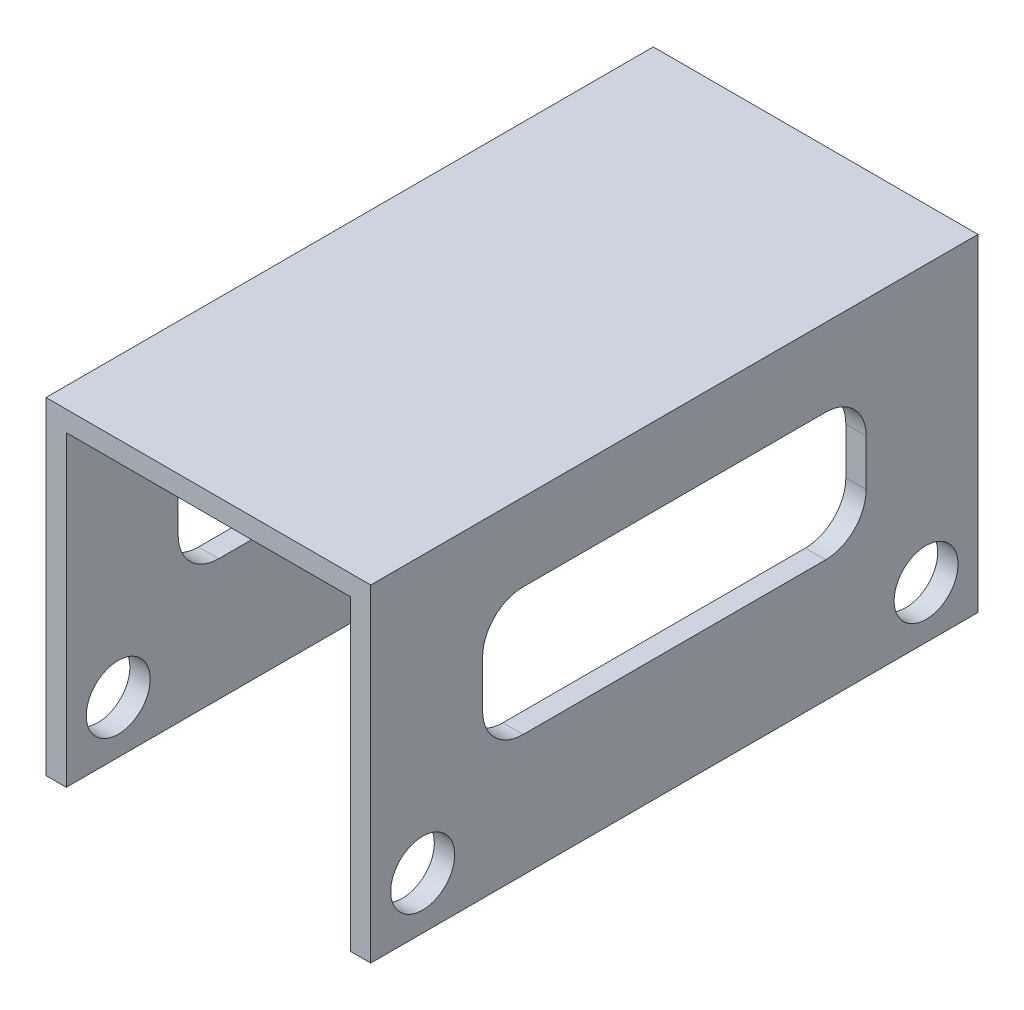
ISO-10303-21;
HEADER;
FILE_DESCRIPTION(('STEP AP214'),'2;1');
FILE_NAME('part.step','',(''),(''),'','','');
FILE_SCHEMA(('AUTOMOTIVE_DESIGN { 1 0 10303 214 1 1 1 1 }'));
ENDSEC;
DATA;
#1=APPLICATION_CONTEXT('core data for automotive mechanical design processes');
#2=APPLICATION_PROTOCOL_DEFINITION('international standard','automotive_design',2000,#1);
#3=PRODUCT_CONTEXT('',#1,'mechanical');
#4=PRODUCT('Part','Part','',(#3));
#5=PRODUCT_RELATED_PRODUCT_CATEGORY('part','',(#4));
#6=PRODUCT_DEFINITION_FORMATION('','',#4);
#7=PRODUCT_DEFINITION_CONTEXT('part definition',#1,'design');
#8=PRODUCT_DEFINITION('design','',#6,#7);
#9=PRODUCT_DEFINITION_SHAPE('','',#8);
#10=(LENGTH_UNIT() NAMED_UNIT(*) SI_UNIT(.MILLI.,.METRE.));
#11=(NAMED_UNIT(*) PLANE_ANGLE_UNIT() SI_UNIT($,.RADIAN.));
#12=(NAMED_UNIT(*) SI_UNIT($,.STERADIAN.) SOLID_ANGLE_UNIT());
#13=UNCERTAINTY_MEASURE_WITH_UNIT(LENGTH_MEASURE(1.E-05),#10,'distance_accuracy_value','');
#14=(GEOMETRIC_REPRESENTATION_CONTEXT(3) GLOBAL_UNCERTAINTY_ASSIGNED_CONTEXT((#13)) GLOBAL_UNIT_ASSIGNED_CONTEXT((#10,
#11,#12)) REPRESENTATION_CONTEXT('',''));
#15=CARTESIAN_POINT('',(0.,0.,0.));
#16=DIRECTION('',(0.,0.,1.));
#17=DIRECTION('',(1.,0.,0.));
#18=AXIS2_PLACEMENT_3D('',#15,#16,#17);
#19=CARTESIAN_POINT('',(0.,0.,95.));
#20=DIRECTION('',(0.,0.,-1.));
#21=DIRECTION('',(-1.,0.,0.));
#22=AXIS2_PLACEMENT_3D('',#19,#20,#21);
#23=PLANE('',#22);
#24=DIRECTION('',(1.,0.,0.));
#25=VECTOR('',#24,1.);
#26=CARTESIAN_POINT('',(-25.4,-13.125,95.));
#27=LINE('',#26,#25);
#28=CARTESIAN_POINT('',(22.225,-13.125,95.));
#29=VERTEX_POINT('',#28);
#30=CARTESIAN_POINT('',(25.4,-13.125,95.));
#31=VERTEX_POINT('',#30);
#32=EDGE_CURVE('E210',#29,#31,#27,.T.);
#33=ORIENTED_EDGE('',*,*,#32,.T.);
#34=DIRECTION('',(0.,1.,0.));
#35=VECTOR('',#34,1.);
#36=CARTESIAN_POINT('',(25.4,-38.1,95.));
#37=LINE('',#36,#35);
#38=CARTESIAN_POINT('',(25.4,38.1,95.));
#39=VERTEX_POINT('',#38);
#40=EDGE_CURVE('E231',#31,#39,#37,.T.);
#41=ORIENTED_EDGE('',*,*,#40,.T.);
#42=DIRECTION('',(-1.,0.,0.));
#43=VECTOR('',#42,1.);
#44=CARTESIAN_POINT('',(-25.4,38.1,95.));
#45=LINE('',#44,#43);
#46=CARTESIAN_POINT('',(-25.4,38.1,95.));
#47=VERTEX_POINT('',#46);
#48=EDGE_CURVE('E225',#39,#47,#45,.T.);
#49=ORIENTED_EDGE('',*,*,#48,.T.);
#50=DIRECTION('',(0.,-1.,0.));
#51=VECTOR('',#50,1.);
#52=CARTESIAN_POINT('',(-25.4,-38.1,95.));
#53=LINE('',#52,#51);
#54=CARTESIAN_POINT('',(-25.4,-13.125,95.));
#55=VERTEX_POINT('',#54);
#56=EDGE_CURVE('E218',#47,#55,#53,.T.);
#57=ORIENTED_EDGE('',*,*,#56,.T.);
#58=CARTESIAN_POINT('',(-22.225,-13.125,95.));
#59=VERTEX_POINT('',#58);
#60=EDGE_CURVE('E199',#55,#59,#27,.T.);
#61=ORIENTED_EDGE('',*,*,#60,.T.);
#62=DIRECTION('',(0.,-1.,0.));
#63=VECTOR('',#62,1.);
#64=CARTESIAN_POINT('',(-22.225,-34.925,95.));
#65=LINE('',#64,#63);
#66=CARTESIAN_POINT('',(-22.225,34.925,95.));
#67=VERTEX_POINT('',#66);
#68=EDGE_CURVE('E413',#67,#59,#65,.T.);
#69=ORIENTED_EDGE('',*,*,#68,.F.);
#70=DIRECTION('',(-1.,0.,0.));
#71=VECTOR('',#70,1.);
#72=CARTESIAN_POINT('',(-22.225,34.925,95.));
#73=LINE('',#72,#71);
#74=CARTESIAN_POINT('',(22.225,34.925,95.));
#75=VERTEX_POINT('',#74);
#76=EDGE_CURVE('E418',#75,#67,#73,.T.);
#77=ORIENTED_EDGE('',*,*,#76,.F.);
#78=DIRECTION('',(0.,1.,0.));
#79=VECTOR('',#78,1.);
#80=CARTESIAN_POINT('',(22.225,-34.925,95.));
#81=LINE('',#80,#79);
#82=EDGE_CURVE('E415',#29,#75,#81,.T.);
#83=ORIENTED_EDGE('',*,*,#82,.F.);
#84=EDGE_LOOP('',(#33,#41,#49,#57,#61,#69,#77,#83));
#85=FACE_BOUND('',#84,.T.);
#86=ADVANCED_FACE('F39',(#85),#23,.F.);
#87=CARTESIAN_POINT('',(0.,0.,0.));
#88=DIRECTION('',(0.,0.,-1.));
#89=DIRECTION('',(-1.,0.,0.));
#90=AXIS2_PLACEMENT_3D('',#87,#88,#89);
#91=PLANE('',#90);
#92=DIRECTION('',(0.,1.,0.));
#93=VECTOR('',#92,1.);
#94=CARTESIAN_POINT('',(25.4,-38.1,0.));
#95=LINE('',#94,#93);
#96=CARTESIAN_POINT('',(25.4,-13.125,0.));
#97=VERTEX_POINT('',#96);
#98=CARTESIAN_POINT('',(25.4,38.1,0.));
#99=VERTEX_POINT('',#98);
#100=EDGE_CURVE('E235',#97,#99,#95,.T.);
#101=ORIENTED_EDGE('',*,*,#100,.F.);
#102=DIRECTION('',(1.,0.,0.));
#103=VECTOR('',#102,1.);
#104=CARTESIAN_POINT('',(-25.4,-13.125,0.));
#105=LINE('',#104,#103);
#106=CARTESIAN_POINT('',(22.225,-13.125,0.));
#107=VERTEX_POINT('',#106);
#108=EDGE_CURVE('E391',#107,#97,#105,.T.);
#109=ORIENTED_EDGE('',*,*,#108,.F.);
#110=DIRECTION('',(0.,1.,0.));
#111=VECTOR('',#110,1.);
#112=CARTESIAN_POINT('',(22.225,-34.925,0.));
#113=LINE('',#112,#111);
#114=CARTESIAN_POINT('',(22.225,34.925,0.));
#115=VERTEX_POINT('',#114);
#116=EDGE_CURVE('E423',#107,#115,#113,.T.);
#117=ORIENTED_EDGE('',*,*,#116,.T.);
#118=DIRECTION('',(-1.,0.,0.));
#119=VECTOR('',#118,1.);
#120=CARTESIAN_POINT('',(-22.225,34.925,0.));
#121=LINE('',#120,#119);
#122=CARTESIAN_POINT('',(-22.225,34.925,0.));
#123=VERTEX_POINT('',#122);
#124=EDGE_CURVE('E416',#115,#123,#121,.T.);
#125=ORIENTED_EDGE('',*,*,#124,.T.);
#126=DIRECTION('',(0.,-1.,0.));
#127=VECTOR('',#126,1.);
#128=CARTESIAN_POINT('',(-22.225,-34.925,0.));
#129=LINE('',#128,#127);
#130=CARTESIAN_POINT('',(-22.225,-13.125,0.));
#131=VERTEX_POINT('',#130);
#132=EDGE_CURVE('E412',#123,#131,#129,.T.);
#133=ORIENTED_EDGE('',*,*,#132,.T.);
#134=CARTESIAN_POINT('',(-25.4,-13.125,0.));
#135=VERTEX_POINT('',#134);
#136=EDGE_CURVE('E390',#135,#131,#105,.T.);
#137=ORIENTED_EDGE('',*,*,#136,.F.);
#138=DIRECTION('',(0.,-1.,0.));
#139=VECTOR('',#138,1.);
#140=CARTESIAN_POINT('',(-25.4,-38.1,0.));
#141=LINE('',#140,#139);
#142=CARTESIAN_POINT('',(-25.4,38.1,0.));
#143=VERTEX_POINT('',#142);
#144=EDGE_CURVE('E220',#143,#135,#141,.T.);
#145=ORIENTED_EDGE('',*,*,#144,.F.);
#146=DIRECTION('',(-1.,0.,0.));
#147=VECTOR('',#146,1.);
#148=CARTESIAN_POINT('',(-25.4,38.1,0.));
#149=LINE('',#148,#147);
#150=EDGE_CURVE('E237',#99,#143,#149,.T.);
#151=ORIENTED_EDGE('',*,*,#150,.F.);
#152=EDGE_LOOP('',(#101,#109,#117,#125,#133,#137,#145,#151));
#153=FACE_BOUND('',#152,.T.);
#154=ADVANCED_FACE('F441',(#153),#91,.T.);
#155=CARTESIAN_POINT('',(25.4,-38.1,95.));
#156=DIRECTION('',(-1.,0.,0.));
#157=DIRECTION('',(0.,0.,1.));
#158=AXIS2_PLACEMENT_3D('',#155,#156,#157);
#159=PLANE('',#158);
#160=DIRECTION('',(0.,0.,1.));
#161=VECTOR('',#160,1.);
#162=CARTESIAN_POINT('',(25.4,25.925,17.5));
#163=LINE('',#162,#161);
#164=CARTESIAN_POINT('',(25.4,25.925,23.85));
#165=VERTEX_POINT('',#164);
#166=CARTESIAN_POINT('',(25.4,25.925,71.15));
#167=VERTEX_POINT('',#166);
#168=EDGE_CURVE('E337',#165,#167,#163,.T.);
#169=ORIENTED_EDGE('',*,*,#168,.F.);
#170=CARTESIAN_POINT('',(25.4,19.575,23.85));
#171=DIRECTION('',(-1.,0.,0.));
#172=DIRECTION('',(0.,0.,1.));
#173=AXIS2_PLACEMENT_3D('',#170,#171,#172);
#174=CIRCLE('',#173,6.35);
#175=CARTESIAN_POINT('',(25.4,19.575,17.5));
#176=VERTEX_POINT('',#175);
#177=EDGE_CURVE('E320',#165,#176,#174,.T.);
#178=ORIENTED_EDGE('',*,*,#177,.T.);
#179=DIRECTION('',(0.,1.,0.));
#180=VECTOR('',#179,1.);
#181=CARTESIAN_POINT('',(25.4,5.92499999999999,17.5));
#182=LINE('',#181,#180);
#183=CARTESIAN_POINT('',(25.4,12.275,17.5));
#184=VERTEX_POINT('',#183);
#185=EDGE_CURVE('E345',#184,#176,#182,.T.);
#186=ORIENTED_EDGE('',*,*,#185,.F.);
#187=CARTESIAN_POINT('',(25.4,12.275,23.85));
#188=DIRECTION('',(-1.,0.,0.));
#189=DIRECTION('',(0.,0.,1.));
#190=AXIS2_PLACEMENT_3D('',#187,#188,#189);
#191=CIRCLE('',#190,6.35);
#192=CARTESIAN_POINT('',(25.4,5.92499999999999,23.85));
#193=VERTEX_POINT('',#192);
#194=EDGE_CURVE('E324',#184,#193,#191,.T.);
#195=ORIENTED_EDGE('',*,*,#194,.T.);
#196=DIRECTION('',(0.,0.,1.));
#197=VECTOR('',#196,1.);
#198=CARTESIAN_POINT('',(25.4,5.92499999999999,17.5));
#199=LINE('',#198,#197);
#200=CARTESIAN_POINT('',(25.4,5.92499999999999,71.15));
#201=VERTEX_POINT('',#200);
#202=EDGE_CURVE('E360',#193,#201,#199,.T.);
#203=ORIENTED_EDGE('',*,*,#202,.T.);
#204=CARTESIAN_POINT('',(25.4,12.275,71.15));
#205=DIRECTION('',(-1.,0.,0.));
#206=DIRECTION('',(0.,0.,1.));
#207=AXIS2_PLACEMENT_3D('',#204,#205,#206);
#208=CIRCLE('',#207,6.35);
#209=CARTESIAN_POINT('',(25.4,12.275,77.5));
#210=VERTEX_POINT('',#209);
#211=EDGE_CURVE('E328',#201,#210,#208,.T.);
#212=ORIENTED_EDGE('',*,*,#211,.T.);
#213=DIRECTION('',(0.,1.,0.));
#214=VECTOR('',#213,1.);
#215=CARTESIAN_POINT('',(25.4,5.92499999999999,77.5));
#216=LINE('',#215,#214);
#217=CARTESIAN_POINT('',(25.4,19.575,77.5));
#218=VERTEX_POINT('',#217);
#219=EDGE_CURVE('E338',#210,#218,#216,.T.);
#220=ORIENTED_EDGE('',*,*,#219,.T.);
#221=CARTESIAN_POINT('',(25.4,19.575,71.15));
#222=DIRECTION('',(-1.,0.,0.));
#223=DIRECTION('',(0.,0.,1.));
#224=AXIS2_PLACEMENT_3D('',#221,#222,#223);
#225=CIRCLE('',#224,6.35);
#226=EDGE_CURVE('E47',#218,#167,#225,.T.);
#227=ORIENTED_EDGE('',*,*,#226,.T.);
#228=EDGE_LOOP('',(#169,#178,#186,#195,#203,#212,#220,#227));
#229=FACE_BOUND('',#228,.T.);
#230=CARTESIAN_POINT('',(25.4,-5.,86.875));
#231=DIRECTION('',(1.,0.,0.));
#232=DIRECTION('',(0.,0.,-1.));
#233=AXIS2_PLACEMENT_3D('',#230,#231,#232);
#234=CIRCLE('',#233,5.);
#235=CARTESIAN_POINT('',(25.4,-5.,81.875));
#236=VERTEX_POINT('',#235);
#237=EDGE_CURVE('E381',#236,#236,#234,.T.);
#238=ORIENTED_EDGE('',*,*,#237,.F.);
#239=EDGE_LOOP('',(#238));
#240=FACE_BOUND('',#239,.T.);
#241=DIRECTION('',(0.,0.,-1.));
#242=VECTOR('',#241,1.);
#243=CARTESIAN_POINT('',(25.4,-13.125,95.));
#244=LINE('',#243,#242);
#245=EDGE_CURVE('E221',#31,#97,#244,.T.);
#246=ORIENTED_EDGE('',*,*,#245,.T.);
#247=ORIENTED_EDGE('',*,*,#100,.T.);
#248=DIRECTION('',(0.,0.,-1.));
#249=VECTOR('',#248,1.);
#250=CARTESIAN_POINT('',(25.4,38.1,95.));
#251=LINE('',#250,#249);
#252=EDGE_CURVE('E229',#39,#99,#251,.T.);
#253=ORIENTED_EDGE('',*,*,#252,.F.);
#254=ORIENTED_EDGE('',*,*,#40,.F.);
#255=EDGE_LOOP('',(#246,#247,#253,#254));
#256=FACE_BOUND('',#255,.T.);
#257=CARTESIAN_POINT('',(25.4,-5.,8.12499999999999));
#258=DIRECTION('',(-1.,0.,0.));
#259=DIRECTION('',(0.,0.,1.));
#260=AXIS2_PLACEMENT_3D('',#257,#258,#259);
#261=CIRCLE('',#260,5.);
#262=CARTESIAN_POINT('',(25.4,-5.,13.125));
#263=VERTEX_POINT('',#262);
#264=EDGE_CURVE('E382',#263,#263,#261,.T.);
#265=ORIENTED_EDGE('',*,*,#264,.T.);
#266=EDGE_LOOP('',(#265));
#267=FACE_BOUND('',#266,.T.);
#268=ADVANCED_FACE('F335',(#229,#240,#256,#267),#159,.F.);
#269=CARTESIAN_POINT('',(-25.4,-38.1,95.));
#270=DIRECTION('',(1.,0.,0.));
#271=DIRECTION('',(0.,0.,-1.));
#272=AXIS2_PLACEMENT_3D('',#269,#270,#271);
#273=PLANE('',#272);
#274=DIRECTION('',(0.,0.,1.));
#275=VECTOR('',#274,1.);
#276=CARTESIAN_POINT('',(-25.4,5.92499999999999,17.5));
#277=LINE('',#276,#275);
#278=CARTESIAN_POINT('',(-25.4,5.92499999999999,23.85));
#279=VERTEX_POINT('',#278);
#280=CARTESIAN_POINT('',(-25.4,5.92499999999999,71.15));
#281=VERTEX_POINT('',#280);
#282=EDGE_CURVE('E375',#279,#281,#277,.T.);
#283=ORIENTED_EDGE('',*,*,#282,.F.);
#284=CARTESIAN_POINT('',(-25.4,12.275,23.85));
#285=DIRECTION('',(1.,0.,0.));
#286=DIRECTION('',(0.,0.,-1.));
#287=AXIS2_PLACEMENT_3D('',#284,#285,#286);
#288=CIRCLE('',#287,6.35);
#289=CARTESIAN_POINT('',(-25.4,12.275,17.5));
#290=VERTEX_POINT('',#289);
#291=EDGE_CURVE('E314',#279,#290,#288,.T.);
#292=ORIENTED_EDGE('',*,*,#291,.T.);
#293=DIRECTION('',(0.,1.,0.));
#294=VECTOR('',#293,1.);
#295=CARTESIAN_POINT('',(-25.4,5.92499999999999,17.5));
#296=LINE('',#295,#294);
#297=CARTESIAN_POINT('',(-25.4,19.575,17.5));
#298=VERTEX_POINT('',#297);
#299=EDGE_CURVE('E363',#290,#298,#296,.T.);
#300=ORIENTED_EDGE('',*,*,#299,.T.);
#301=CARTESIAN_POINT('',(-25.4,19.575,23.85));
#302=DIRECTION('',(1.,0.,0.));
#303=DIRECTION('',(0.,0.,-1.));
#304=AXIS2_PLACEMENT_3D('',#301,#302,#303);
#305=CIRCLE('',#304,6.35);
#306=CARTESIAN_POINT('',(-25.4,25.925,23.85));
#307=VERTEX_POINT('',#306);
#308=EDGE_CURVE('E318',#298,#307,#305,.T.);
#309=ORIENTED_EDGE('',*,*,#308,.T.);
#310=DIRECTION('',(0.,0.,1.));
#311=VECTOR('',#310,1.);
#312=CARTESIAN_POINT('',(-25.4,25.925,17.5));
#313=LINE('',#312,#311);
#314=CARTESIAN_POINT('',(-25.4,25.925,71.15));
#315=VERTEX_POINT('',#314);
#316=EDGE_CURVE('E366',#307,#315,#313,.T.);
#317=ORIENTED_EDGE('',*,*,#316,.T.);
#318=CARTESIAN_POINT('',(-25.4,19.575,71.15));
#319=DIRECTION('',(1.,0.,0.));
#320=DIRECTION('',(0.,0.,-1.));
#321=AXIS2_PLACEMENT_3D('',#318,#319,#320);
#322=CIRCLE('',#321,6.35);
#323=CARTESIAN_POINT('',(-25.4,19.575,77.5));
#324=VERTEX_POINT('',#323);
#325=EDGE_CURVE('E310',#315,#324,#322,.T.);
#326=ORIENTED_EDGE('',*,*,#325,.T.);
#327=DIRECTION('',(0.,1.,0.));
#328=VECTOR('',#327,1.);
#329=CARTESIAN_POINT('',(-25.4,5.92499999999999,77.5));
#330=LINE('',#329,#328);
#331=CARTESIAN_POINT('',(-25.4,12.275,77.5));
#332=VERTEX_POINT('',#331);
#333=EDGE_CURVE('E372',#332,#324,#330,.T.);
#334=ORIENTED_EDGE('',*,*,#333,.F.);
#335=CARTESIAN_POINT('',(-25.4,12.275,71.15));
#336=DIRECTION('',(1.,0.,0.));
#337=DIRECTION('',(0.,0.,-1.));
#338=AXIS2_PLACEMENT_3D('',#335,#336,#337);
#339=CIRCLE('',#338,6.35);
#340=EDGE_CURVE('E306',#332,#281,#339,.T.);
#341=ORIENTED_EDGE('',*,*,#340,.T.);
#342=EDGE_LOOP('',(#283,#292,#300,#309,#317,#326,#334,#341));
#343=FACE_BOUND('',#342,.T.);
#344=CARTESIAN_POINT('',(-25.4,-5.,86.875));
#345=DIRECTION('',(1.,0.,0.));
#346=DIRECTION('',(0.,0.,-1.));
#347=AXIS2_PLACEMENT_3D('',#344,#345,#346);
#348=CIRCLE('',#347,5.);
#349=CARTESIAN_POINT('',(-25.4,-5.,81.875));
#350=VERTEX_POINT('',#349);
#351=EDGE_CURVE('E378',#350,#350,#348,.T.);
#352=ORIENTED_EDGE('',*,*,#351,.T.);
#353=EDGE_LOOP('',(#352));
#354=FACE_BOUND('',#353,.T.);
#355=DIRECTION('',(0.,0.,-1.));
#356=VECTOR('',#355,1.);
#357=CARTESIAN_POINT('',(-25.4,-13.125,95.));
#358=LINE('',#357,#356);
#359=EDGE_CURVE('E202',#55,#135,#358,.T.);
#360=ORIENTED_EDGE('',*,*,#359,.F.);
#361=ORIENTED_EDGE('',*,*,#56,.F.);
#362=DIRECTION('',(0.,0.,-1.));
#363=VECTOR('',#362,1.);
#364=CARTESIAN_POINT('',(-25.4,38.1,95.));
#365=LINE('',#364,#363);
#366=EDGE_CURVE('E227',#47,#143,#365,.T.);
#367=ORIENTED_EDGE('',*,*,#366,.T.);
#368=ORIENTED_EDGE('',*,*,#144,.T.);
#369=EDGE_LOOP('',(#360,#361,#367,#368));
#370=FACE_BOUND('',#369,.T.);
#371=CARTESIAN_POINT('',(-25.4,-5.,8.12499999999999));
#372=DIRECTION('',(-1.,0.,0.));
#373=DIRECTION('',(0.,0.,1.));
#374=AXIS2_PLACEMENT_3D('',#371,#372,#373);
#375=CIRCLE('',#374,5.);
#376=CARTESIAN_POINT('',(-25.4,-5.,13.125));
#377=VERTEX_POINT('',#376);
#378=EDGE_CURVE('E385',#377,#377,#375,.T.);
#379=ORIENTED_EDGE('',*,*,#378,.F.);
#380=EDGE_LOOP('',(#379));
#381=FACE_BOUND('',#380,.T.);
#382=ADVANCED_FACE('F215',(#343,#354,#370,#381),#273,.F.);
#383=CARTESIAN_POINT('',(-22.225,-34.925,95.));
#384=DIRECTION('',(1.,0.,0.));
#385=DIRECTION('',(0.,0.,-1.));
#386=AXIS2_PLACEMENT_3D('',#383,#384,#385);
#387=PLANE('',#386);
#388=DIRECTION('',(0.,1.,0.));
#389=VECTOR('',#388,1.);
#390=CARTESIAN_POINT('',(-22.225,-34.925,17.5));
#391=LINE('',#390,#389);
#392=CARTESIAN_POINT('',(-22.225,12.275,17.5));
#393=VERTEX_POINT('',#392);
#394=CARTESIAN_POINT('',(-22.225,19.575,17.5));
#395=VERTEX_POINT('',#394);
#396=EDGE_CURVE('E409',#393,#395,#391,.T.);
#397=ORIENTED_EDGE('',*,*,#396,.F.);
#398=CARTESIAN_POINT('',(-22.225,12.275,23.85));
#399=DIRECTION('',(1.,0.,0.));
#400=DIRECTION('',(0.,0.,-1.));
#401=AXIS2_PLACEMENT_3D('',#398,#399,#400);
#402=CIRCLE('',#401,6.35);
#403=CARTESIAN_POINT('',(-22.225,5.92499999999999,23.85));
#404=VERTEX_POINT('',#403);
#405=EDGE_CURVE('E312',#393,#404,#402,.F.);
#406=ORIENTED_EDGE('',*,*,#405,.T.);
#407=DIRECTION('',(0.,0.,1.));
#408=VECTOR('',#407,1.);
#409=CARTESIAN_POINT('',(-22.225,5.92499999999999,95.));
#410=LINE('',#409,#408);
#411=CARTESIAN_POINT('',(-22.225,5.92499999999999,71.15));
#412=VERTEX_POINT('',#411);
#413=EDGE_CURVE('E406',#404,#412,#410,.T.);
#414=ORIENTED_EDGE('',*,*,#413,.T.);
#415=CARTESIAN_POINT('',(-22.225,12.275,71.15));
#416=DIRECTION('',(1.,0.,0.));
#417=DIRECTION('',(0.,0.,-1.));
#418=AXIS2_PLACEMENT_3D('',#415,#416,#417);
#419=CIRCLE('',#418,6.35);
#420=CARTESIAN_POINT('',(-22.225,12.275,77.5));
#421=VERTEX_POINT('',#420);
#422=EDGE_CURVE('E304',#412,#421,#419,.F.);
#423=ORIENTED_EDGE('',*,*,#422,.T.);
#424=DIRECTION('',(0.,1.,0.));
#425=VECTOR('',#424,1.);
#426=CARTESIAN_POINT('',(-22.225,-34.925,77.5));
#427=LINE('',#426,#425);
#428=CARTESIAN_POINT('',(-22.225,19.575,77.5));
#429=VERTEX_POINT('',#428);
#430=EDGE_CURVE('E403',#421,#429,#427,.T.);
#431=ORIENTED_EDGE('',*,*,#430,.T.);
#432=CARTESIAN_POINT('',(-22.225,19.575,71.15));
#433=DIRECTION('',(1.,0.,0.));
#434=DIRECTION('',(0.,0.,-1.));
#435=AXIS2_PLACEMENT_3D('',#432,#433,#434);
#436=CIRCLE('',#435,6.35);
#437=CARTESIAN_POINT('',(-22.225,25.925,71.15));
#438=VERTEX_POINT('',#437);
#439=EDGE_CURVE('E308',#429,#438,#436,.F.);
#440=ORIENTED_EDGE('',*,*,#439,.T.);
#441=DIRECTION('',(0.,0.,1.));
#442=VECTOR('',#441,1.);
#443=CARTESIAN_POINT('',(-22.225,25.925,95.));
#444=LINE('',#443,#442);
#445=CARTESIAN_POINT('',(-22.225,25.925,23.85));
#446=VERTEX_POINT('',#445);
#447=EDGE_CURVE('E400',#446,#438,#444,.T.);
#448=ORIENTED_EDGE('',*,*,#447,.F.);
#449=CARTESIAN_POINT('',(-22.225,19.575,23.85));
#450=DIRECTION('',(1.,0.,0.));
#451=DIRECTION('',(0.,0.,-1.));
#452=AXIS2_PLACEMENT_3D('',#449,#450,#451);
#453=CIRCLE('',#452,6.35);
#454=EDGE_CURVE('E316',#446,#395,#453,.F.);
#455=ORIENTED_EDGE('',*,*,#454,.T.);
#456=EDGE_LOOP('',(#397,#406,#414,#423,#431,#440,#448,#455));
#457=FACE_BOUND('',#456,.T.);
#458=CARTESIAN_POINT('',(-22.225,-5.,86.875));
#459=DIRECTION('',(1.,0.,0.));
#460=DIRECTION('',(0.,0.,-1.));
#461=AXIS2_PLACEMENT_3D('',#458,#459,#460);
#462=CIRCLE('',#461,5.);
#463=CARTESIAN_POINT('',(-22.225,-5.,81.875));
#464=VERTEX_POINT('',#463);
#465=EDGE_CURVE('E254',#464,#464,#462,.T.);
#466=ORIENTED_EDGE('',*,*,#465,.F.);
#467=EDGE_LOOP('',(#466));
#468=FACE_BOUND('',#467,.T.);
#469=ORIENTED_EDGE('',*,*,#68,.T.);
#470=DIRECTION('',(0.,0.,-1.));
#471=VECTOR('',#470,1.);
#472=CARTESIAN_POINT('',(-22.225,-13.125,95.));
#473=LINE('',#472,#471);
#474=EDGE_CURVE('E205',#59,#131,#473,.T.);
#475=ORIENTED_EDGE('',*,*,#474,.T.);
#476=ORIENTED_EDGE('',*,*,#132,.F.);
#477=DIRECTION('',(0.,0.,-1.));
#478=VECTOR('',#477,1.);
#479=CARTESIAN_POINT('',(-22.225,34.925,95.));
#480=LINE('',#479,#478);
#481=EDGE_CURVE('E420',#67,#123,#480,.T.);
#482=ORIENTED_EDGE('',*,*,#481,.F.);
#483=EDGE_LOOP('',(#469,#475,#476,#482));
#484=FACE_BOUND('',#483,.T.);
#485=CARTESIAN_POINT('',(-22.225,-5.,8.12499999999999));
#486=DIRECTION('',(1.,0.,0.));
#487=DIRECTION('',(0.,0.,-1.));
#488=AXIS2_PLACEMENT_3D('',#485,#486,#487);
#489=CIRCLE('',#488,5.);
#490=CARTESIAN_POINT('',(-22.225,-5.,3.12499999999999));
#491=VERTEX_POINT('',#490);
#492=EDGE_CURVE('E250',#491,#491,#489,.F.);
#493=ORIENTED_EDGE('',*,*,#492,.T.);
#494=EDGE_LOOP('',(#493));
#495=FACE_BOUND('',#494,.T.);
#496=ADVANCED_FACE('F443',(#457,#468,#484,#495),#387,.T.);
#497=CARTESIAN_POINT('',(22.225,-34.925,95.));
#498=DIRECTION('',(-1.,0.,0.));
#499=DIRECTION('',(0.,-1.,0.));
#500=AXIS2_PLACEMENT_3D('',#497,#498,#499);
#501=PLANE('',#500);
#502=DIRECTION('',(0.,-1.,0.));
#503=VECTOR('',#502,1.);
#504=CARTESIAN_POINT('',(22.225,-34.925,17.5));
#505=LINE('',#504,#503);
#506=CARTESIAN_POINT('',(22.225,19.575,17.5));
#507=VERTEX_POINT('',#506);
#508=CARTESIAN_POINT('',(22.225,12.275,17.5));
#509=VERTEX_POINT('',#508);
#510=EDGE_CURVE('E262',#507,#509,#505,.T.);
#511=ORIENTED_EDGE('',*,*,#510,.F.);
#512=CARTESIAN_POINT('',(22.225,19.575,23.85));
#513=DIRECTION('',(-1.,0.,0.));
#514=DIRECTION('',(0.,-1.,0.));
#515=AXIS2_PLACEMENT_3D('',#512,#513,#514);
#516=CIRCLE('',#515,6.35);
#517=CARTESIAN_POINT('',(22.225,25.925,23.85));
#518=VERTEX_POINT('',#517);
#519=EDGE_CURVE('E322',#507,#518,#516,.F.);
#520=ORIENTED_EDGE('',*,*,#519,.T.);
#521=DIRECTION('',(0.,0.,-1.));
#522=VECTOR('',#521,1.);
#523=CARTESIAN_POINT('',(22.225,25.925,95.));
#524=LINE('',#523,#522);
#525=CARTESIAN_POINT('',(22.225,25.925,71.15));
#526=VERTEX_POINT('',#525);
#527=EDGE_CURVE('E246',#526,#518,#524,.T.);
#528=ORIENTED_EDGE('',*,*,#527,.F.);
#529=CARTESIAN_POINT('',(22.225,19.575,71.15));
#530=DIRECTION('',(-1.,0.,0.));
#531=DIRECTION('',(0.,-1.,0.));
#532=AXIS2_PLACEMENT_3D('',#529,#530,#531);
#533=CIRCLE('',#532,6.35);
#534=CARTESIAN_POINT('',(22.225,19.575,77.5));
#535=VERTEX_POINT('',#534);
#536=EDGE_CURVE('E11',#526,#535,#533,.F.);
#537=ORIENTED_EDGE('',*,*,#536,.T.);
#538=DIRECTION('',(0.,-1.,0.));
#539=VECTOR('',#538,1.);
#540=CARTESIAN_POINT('',(22.225,-34.925,77.5));
#541=LINE('',#540,#539);
#542=CARTESIAN_POINT('',(22.225,12.275,77.5));
#543=VERTEX_POINT('',#542);
#544=EDGE_CURVE('E257',#535,#543,#541,.T.);
#545=ORIENTED_EDGE('',*,*,#544,.T.);
#546=CARTESIAN_POINT('',(22.225,12.275,71.15));
#547=DIRECTION('',(-1.,0.,0.));
#548=DIRECTION('',(0.,-1.,0.));
#549=AXIS2_PLACEMENT_3D('',#546,#547,#548);
#550=CIRCLE('',#549,6.35);
#551=CARTESIAN_POINT('',(22.225,5.92499999999999,71.15));
#552=VERTEX_POINT('',#551);
#553=EDGE_CURVE('E330',#543,#552,#550,.F.);
#554=ORIENTED_EDGE('',*,*,#553,.T.);
#555=DIRECTION('',(0.,0.,-1.));
#556=VECTOR('',#555,1.);
#557=CARTESIAN_POINT('',(22.225,5.92499999999999,95.));
#558=LINE('',#557,#556);
#559=CARTESIAN_POINT('',(22.225,5.92499999999999,23.85));
#560=VERTEX_POINT('',#559);
#561=EDGE_CURVE('E259',#552,#560,#558,.T.);
#562=ORIENTED_EDGE('',*,*,#561,.T.);
#563=CARTESIAN_POINT('',(22.225,12.275,23.85));
#564=DIRECTION('',(-1.,0.,0.));
#565=DIRECTION('',(0.,-1.,0.));
#566=AXIS2_PLACEMENT_3D('',#563,#564,#565);
#567=CIRCLE('',#566,6.35);
#568=EDGE_CURVE('E326',#560,#509,#567,.F.);
#569=ORIENTED_EDGE('',*,*,#568,.T.);
#570=EDGE_LOOP('',(#511,#520,#528,#537,#545,#554,#562,#569));
#571=FACE_BOUND('',#570,.T.);
#572=CARTESIAN_POINT('',(22.225,-5.,86.875));
#573=DIRECTION('',(-1.,0.,0.));
#574=DIRECTION('',(0.,-1.,0.));
#575=AXIS2_PLACEMENT_3D('',#572,#573,#574);
#576=CIRCLE('',#575,5.);
#577=CARTESIAN_POINT('',(22.225,-10.,86.875));
#578=VERTEX_POINT('',#577);
#579=EDGE_CURVE('E251',#578,#578,#576,.T.);
#580=ORIENTED_EDGE('',*,*,#579,.F.);
#581=EDGE_LOOP('',(#580));
#582=FACE_BOUND('',#581,.T.);
#583=ORIENTED_EDGE('',*,*,#116,.F.);
#584=DIRECTION('',(0.,0.,1.));
#585=VECTOR('',#584,1.);
#586=CARTESIAN_POINT('',(22.225,-13.125,95.));
#587=LINE('',#586,#585);
#588=EDGE_CURVE('E243',#107,#29,#587,.T.);
#589=ORIENTED_EDGE('',*,*,#588,.T.);
#590=ORIENTED_EDGE('',*,*,#82,.T.);
#591=DIRECTION('',(0.,0.,-1.));
#592=VECTOR('',#591,1.);
#593=CARTESIAN_POINT('',(22.225,34.925,95.));
#594=LINE('',#593,#592);
#595=EDGE_CURVE('E238',#75,#115,#594,.T.);
#596=ORIENTED_EDGE('',*,*,#595,.T.);
#597=EDGE_LOOP('',(#583,#589,#590,#596));
#598=FACE_BOUND('',#597,.T.);
#599=CARTESIAN_POINT('',(22.225,-5.,8.12499999999999));
#600=DIRECTION('',(-1.,0.,0.));
#601=DIRECTION('',(0.,-1.,0.));
#602=AXIS2_PLACEMENT_3D('',#599,#600,#601);
#603=CIRCLE('',#602,5.);
#604=CARTESIAN_POINT('',(22.225,-10.,8.12499999999999));
#605=VERTEX_POINT('',#604);
#606=EDGE_CURVE('E247',#605,#605,#603,.F.);
#607=ORIENTED_EDGE('',*,*,#606,.T.);
#608=EDGE_LOOP('',(#607));
#609=FACE_BOUND('',#608,.T.);
#610=ADVANCED_FACE('F350',(#571,#582,#598,#609),#501,.T.);
#611=CARTESIAN_POINT('',(-25.4,38.1,95.));
#612=DIRECTION('',(0.,-1.,0.));
#613=DIRECTION('',(0.,0.,-1.));
#614=AXIS2_PLACEMENT_3D('',#611,#612,#613);
#615=PLANE('',#614);
#616=ORIENTED_EDGE('',*,*,#150,.T.);
#617=ORIENTED_EDGE('',*,*,#366,.F.);
#618=ORIENTED_EDGE('',*,*,#48,.F.);
#619=ORIENTED_EDGE('',*,*,#252,.T.);
#620=EDGE_LOOP('',(#616,#617,#618,#619));
#621=FACE_BOUND('',#620,.T.);
#622=ADVANCED_FACE('F435',(#621),#615,.F.);
#623=CARTESIAN_POINT('',(-22.225,34.925,95.));
#624=DIRECTION('',(0.,-1.,0.));
#625=DIRECTION('',(1.,0.,0.));
#626=AXIS2_PLACEMENT_3D('',#623,#624,#625);
#627=PLANE('',#626);
#628=ORIENTED_EDGE('',*,*,#124,.F.);
#629=ORIENTED_EDGE('',*,*,#595,.F.);
#630=ORIENTED_EDGE('',*,*,#76,.T.);
#631=ORIENTED_EDGE('',*,*,#481,.T.);
#632=EDGE_LOOP('',(#628,#629,#630,#631));
#633=FACE_BOUND('',#632,.T.);
#634=ADVANCED_FACE('F450',(#633),#627,.T.);
#635=CARTESIAN_POINT('',(-25.4,-13.125,95.));
#636=DIRECTION('',(0.,-1.,0.));
#637=DIRECTION('',(0.,0.,-1.));
#638=AXIS2_PLACEMENT_3D('',#635,#636,#637);
#639=PLANE('',#638);
#640=ORIENTED_EDGE('',*,*,#108,.T.);
#641=ORIENTED_EDGE('',*,*,#245,.F.);
#642=ORIENTED_EDGE('',*,*,#32,.F.);
#643=ORIENTED_EDGE('',*,*,#588,.F.);
#644=EDGE_LOOP('',(#640,#641,#642,#643));
#645=FACE_BOUND('',#644,.T.);
#646=ADVANCED_FACE('F455',(#645),#639,.T.);
#647=CARTESIAN_POINT('',(-25.4,-5.,8.12499999999999));
#648=DIRECTION('',(1.,0.,0.));
#649=DIRECTION('',(0.,0.,-1.));
#650=AXIS2_PLACEMENT_3D('',#647,#648,#649);
#651=CYLINDRICAL_SURFACE('',#650,5.);
#652=ORIENTED_EDGE('',*,*,#606,.F.);
#653=EDGE_LOOP('',(#652));
#654=FACE_BOUND('',#653,.T.);
#655=ORIENTED_EDGE('',*,*,#264,.F.);
#656=EDGE_LOOP('',(#655));
#657=FACE_BOUND('',#656,.T.);
#658=ADVANCED_FACE('F457',(#654,#657),#651,.F.);
#659=CARTESIAN_POINT('',(-25.4,-5.,86.875));
#660=DIRECTION('',(1.,0.,0.));
#661=DIRECTION('',(0.,0.,-1.));
#662=AXIS2_PLACEMENT_3D('',#659,#660,#661);
#663=CYLINDRICAL_SURFACE('',#662,5.);
#664=ORIENTED_EDGE('',*,*,#579,.T.);
#665=EDGE_LOOP('',(#664));
#666=FACE_BOUND('',#665,.T.);
#667=ORIENTED_EDGE('',*,*,#237,.T.);
#668=EDGE_LOOP('',(#667));
#669=FACE_BOUND('',#668,.T.);
#670=ADVANCED_FACE('F463',(#666,#669),#663,.F.);
#671=CARTESIAN_POINT('',(-25.4,25.925,17.5));
#672=DIRECTION('',(0.,1.,0.));
#673=DIRECTION('',(0.,0.,1.));
#674=AXIS2_PLACEMENT_3D('',#671,#672,#673);
#675=PLANE('',#674);
#676=ORIENTED_EDGE('',*,*,#527,.T.);
#677=DIRECTION('',(1.,0.,0.));
#678=VECTOR('',#677,1.);
#679=CARTESIAN_POINT('',(25.4,25.925,23.85));
#680=LINE('',#679,#678);
#681=EDGE_CURVE('E287',#518,#165,#680,.T.);
#682=ORIENTED_EDGE('',*,*,#681,.T.);
#683=ORIENTED_EDGE('',*,*,#168,.T.);
#684=DIRECTION('',(1.,0.,0.));
#685=VECTOR('',#684,1.);
#686=CARTESIAN_POINT('',(-25.4,25.925,71.15));
#687=LINE('',#686,#685);
#688=EDGE_CURVE('E285',#167,#526,#687,.F.);
#689=ORIENTED_EDGE('',*,*,#688,.T.);
#690=EDGE_LOOP('',(#676,#682,#683,#689));
#691=FACE_BOUND('',#690,.T.);
#692=ADVANCED_FACE('F343',(#691),#675,.F.);
#693=CARTESIAN_POINT('',(-25.4,5.92499999999999,77.5));
#694=DIRECTION('',(0.,0.,-1.));
#695=DIRECTION('',(-1.,0.,0.));
#696=AXIS2_PLACEMENT_3D('',#693,#694,#695);
#697=PLANE('',#696);
#698=ORIENTED_EDGE('',*,*,#219,.F.);
#699=DIRECTION('',(1.,0.,0.));
#700=VECTOR('',#699,1.);
#701=CARTESIAN_POINT('',(22.225,12.275,77.5));
#702=LINE('',#701,#700);
#703=EDGE_CURVE('E54',#210,#543,#702,.F.);
#704=ORIENTED_EDGE('',*,*,#703,.T.);
#705=ORIENTED_EDGE('',*,*,#544,.F.);
#706=DIRECTION('',(1.,0.,0.));
#707=VECTOR('',#706,1.);
#708=CARTESIAN_POINT('',(-25.4,19.575,77.5));
#709=LINE('',#708,#707);
#710=EDGE_CURVE('E300',#535,#218,#709,.T.);
#711=ORIENTED_EDGE('',*,*,#710,.T.);
#712=EDGE_LOOP('',(#698,#704,#705,#711));
#713=FACE_BOUND('',#712,.T.);
#714=ADVANCED_FACE('F347',(#713),#697,.T.);
#715=CARTESIAN_POINT('',(-25.4,5.92499999999999,17.5));
#716=DIRECTION('',(0.,1.,0.));
#717=DIRECTION('',(0.,0.,1.));
#718=AXIS2_PLACEMENT_3D('',#715,#716,#717);
#719=PLANE('',#718);
#720=ORIENTED_EDGE('',*,*,#202,.F.);
#721=DIRECTION('',(1.,0.,0.));
#722=VECTOR('',#721,1.);
#723=CARTESIAN_POINT('',(-25.4,5.92499999999999,23.85));
#724=LINE('',#723,#722);
#725=EDGE_CURVE('E298',#193,#560,#724,.F.);
#726=ORIENTED_EDGE('',*,*,#725,.T.);
#727=ORIENTED_EDGE('',*,*,#561,.F.);
#728=DIRECTION('',(1.,0.,0.));
#729=VECTOR('',#728,1.);
#730=CARTESIAN_POINT('',(25.4,5.92499999999999,71.15));
#731=LINE('',#730,#729);
#732=EDGE_CURVE('E295',#552,#201,#731,.T.);
#733=ORIENTED_EDGE('',*,*,#732,.T.);
#734=EDGE_LOOP('',(#720,#726,#727,#733));
#735=FACE_BOUND('',#734,.T.);
#736=ADVANCED_FACE('F359',(#735),#719,.T.);
#737=CARTESIAN_POINT('',(-25.4,5.92499999999999,17.5));
#738=DIRECTION('',(0.,0.,-1.));
#739=DIRECTION('',(-1.,0.,0.));
#740=AXIS2_PLACEMENT_3D('',#737,#738,#739);
#741=PLANE('',#740);
#742=ORIENTED_EDGE('',*,*,#185,.T.);
#743=DIRECTION('',(1.,0.,0.));
#744=VECTOR('',#743,1.);
#745=CARTESIAN_POINT('',(22.225,19.575,17.5));
#746=LINE('',#745,#744);
#747=EDGE_CURVE('E293',#176,#507,#746,.F.);
#748=ORIENTED_EDGE('',*,*,#747,.T.);
#749=ORIENTED_EDGE('',*,*,#510,.T.);
#750=DIRECTION('',(1.,0.,0.));
#751=VECTOR('',#750,1.);
#752=CARTESIAN_POINT('',(-25.4,12.275,17.5));
#753=LINE('',#752,#751);
#754=EDGE_CURVE('E290',#509,#184,#753,.T.);
#755=ORIENTED_EDGE('',*,*,#754,.T.);
#756=EDGE_LOOP('',(#742,#748,#749,#755));
#757=FACE_BOUND('',#756,.T.);
#758=ADVANCED_FACE('F470',(#757),#741,.F.);
#759=ORIENTED_EDGE('',*,*,#60,.F.);
#760=ORIENTED_EDGE('',*,*,#359,.T.);
#761=ORIENTED_EDGE('',*,*,#136,.T.);
#762=ORIENTED_EDGE('',*,*,#474,.F.);
#763=EDGE_LOOP('',(#759,#760,#761,#762));
#764=FACE_BOUND('',#763,.T.);
#765=ADVANCED_FACE('F201',(#764),#639,.T.);
#766=ORIENTED_EDGE('',*,*,#492,.F.);
#767=EDGE_LOOP('',(#766));
#768=FACE_BOUND('',#767,.T.);
#769=ORIENTED_EDGE('',*,*,#378,.T.);
#770=EDGE_LOOP('',(#769));
#771=FACE_BOUND('',#770,.T.);
#772=ADVANCED_FACE('F466',(#768,#771),#651,.F.);
#773=ORIENTED_EDGE('',*,*,#465,.T.);
#774=EDGE_LOOP('',(#773));
#775=FACE_BOUND('',#774,.T.);
#776=ORIENTED_EDGE('',*,*,#351,.F.);
#777=EDGE_LOOP('',(#776));
#778=FACE_BOUND('',#777,.T.);
#779=ADVANCED_FACE('F596',(#775,#778),#663,.F.);
#780=ORIENTED_EDGE('',*,*,#299,.F.);
#781=DIRECTION('',(1.,0.,0.));
#782=VECTOR('',#781,1.);
#783=CARTESIAN_POINT('',(-25.4,12.275,17.5));
#784=LINE('',#783,#782);
#785=EDGE_CURVE('E282',#290,#393,#784,.T.);
#786=ORIENTED_EDGE('',*,*,#785,.T.);
#787=ORIENTED_EDGE('',*,*,#396,.T.);
#788=DIRECTION('',(1.,0.,0.));
#789=VECTOR('',#788,1.);
#790=CARTESIAN_POINT('',(-25.4,19.575,17.5));
#791=LINE('',#790,#789);
#792=EDGE_CURVE('E280',#395,#298,#791,.F.);
#793=ORIENTED_EDGE('',*,*,#792,.T.);
#794=EDGE_LOOP('',(#780,#786,#787,#793));
#795=FACE_BOUND('',#794,.T.);
#796=ADVANCED_FACE('F586',(#795),#741,.F.);
#797=ORIENTED_EDGE('',*,*,#282,.T.);
#798=DIRECTION('',(1.,0.,0.));
#799=VECTOR('',#798,1.);
#800=CARTESIAN_POINT('',(-22.225,5.92499999999999,71.15));
#801=LINE('',#800,#799);
#802=EDGE_CURVE('E267',#281,#412,#801,.T.);
#803=ORIENTED_EDGE('',*,*,#802,.T.);
#804=ORIENTED_EDGE('',*,*,#413,.F.);
#805=DIRECTION('',(1.,0.,0.));
#806=VECTOR('',#805,1.);
#807=CARTESIAN_POINT('',(-25.4,5.92499999999999,23.85));
#808=LINE('',#807,#806);
#809=EDGE_CURVE('E265',#404,#279,#808,.F.);
#810=ORIENTED_EDGE('',*,*,#809,.T.);
#811=EDGE_LOOP('',(#797,#803,#804,#810));
#812=FACE_BOUND('',#811,.T.);
#813=ADVANCED_FACE('F576',(#812),#719,.T.);
#814=ORIENTED_EDGE('',*,*,#430,.F.);
#815=DIRECTION('',(1.,0.,0.));
#816=VECTOR('',#815,1.);
#817=CARTESIAN_POINT('',(-25.4,12.275,77.5));
#818=LINE('',#817,#816);
#819=EDGE_CURVE('E273',#421,#332,#818,.F.);
#820=ORIENTED_EDGE('',*,*,#819,.T.);
#821=ORIENTED_EDGE('',*,*,#333,.T.);
#822=DIRECTION('',(1.,0.,0.));
#823=VECTOR('',#822,1.);
#824=CARTESIAN_POINT('',(-25.4,19.575,77.5));
#825=LINE('',#824,#823);
#826=EDGE_CURVE('E270',#324,#429,#825,.T.);
#827=ORIENTED_EDGE('',*,*,#826,.T.);
#828=EDGE_LOOP('',(#814,#820,#821,#827));
#829=FACE_BOUND('',#828,.T.);
#830=ADVANCED_FACE('F566',(#829),#697,.T.);
#831=ORIENTED_EDGE('',*,*,#447,.T.);
#832=DIRECTION('',(1.,0.,0.));
#833=VECTOR('',#832,1.);
#834=CARTESIAN_POINT('',(-25.4,25.925,71.15));
#835=LINE('',#834,#833);
#836=EDGE_CURVE('E278',#438,#315,#835,.F.);
#837=ORIENTED_EDGE('',*,*,#836,.T.);
#838=ORIENTED_EDGE('',*,*,#316,.F.);
#839=DIRECTION('',(1.,0.,0.));
#840=VECTOR('',#839,1.);
#841=CARTESIAN_POINT('',(-22.225,25.925,23.85));
#842=LINE('',#841,#840);
#843=EDGE_CURVE('E275',#307,#446,#842,.T.);
#844=ORIENTED_EDGE('',*,*,#843,.T.);
#845=EDGE_LOOP('',(#831,#837,#838,#844));
#846=FACE_BOUND('',#845,.T.);
#847=ADVANCED_FACE('F490',(#846),#675,.F.);
#848=CARTESIAN_POINT('',(-25.4,12.275,71.15));
#849=DIRECTION('',(-1.,0.,0.));
#850=DIRECTION('',(0.,0.,1.));
#851=AXIS2_PLACEMENT_3D('',#848,#849,#850);
#852=CYLINDRICAL_SURFACE('',#851,6.35);
#853=ORIENTED_EDGE('',*,*,#340,.F.);
#854=ORIENTED_EDGE('',*,*,#819,.F.);
#855=ORIENTED_EDGE('',*,*,#422,.F.);
#856=ORIENTED_EDGE('',*,*,#802,.F.);
#857=EDGE_LOOP('',(#853,#854,#855,#856));
#858=FACE_BOUND('',#857,.T.);
#859=ADVANCED_FACE('F486',(#858),#852,.F.);
#860=CARTESIAN_POINT('',(-25.4,19.575,71.15));
#861=DIRECTION('',(1.,0.,0.));
#862=DIRECTION('',(0.,0.,-1.));
#863=AXIS2_PLACEMENT_3D('',#860,#861,#862);
#864=CYLINDRICAL_SURFACE('',#863,6.35);
#865=ORIENTED_EDGE('',*,*,#325,.F.);
#866=ORIENTED_EDGE('',*,*,#836,.F.);
#867=ORIENTED_EDGE('',*,*,#439,.F.);
#868=ORIENTED_EDGE('',*,*,#826,.F.);
#869=EDGE_LOOP('',(#865,#866,#867,#868));
#870=FACE_BOUND('',#869,.T.);
#871=ADVANCED_FACE('F489',(#870),#864,.F.);
#872=CARTESIAN_POINT('',(-25.4,12.275,23.85));
#873=DIRECTION('',(1.,0.,0.));
#874=DIRECTION('',(0.,0.,-1.));
#875=AXIS2_PLACEMENT_3D('',#872,#873,#874);
#876=CYLINDRICAL_SURFACE('',#875,6.35);
#877=ORIENTED_EDGE('',*,*,#291,.F.);
#878=ORIENTED_EDGE('',*,*,#809,.F.);
#879=ORIENTED_EDGE('',*,*,#405,.F.);
#880=ORIENTED_EDGE('',*,*,#785,.F.);
#881=EDGE_LOOP('',(#877,#878,#879,#880));
#882=FACE_BOUND('',#881,.T.);
#883=ADVANCED_FACE('F494',(#882),#876,.F.);
#884=CARTESIAN_POINT('',(-25.4,19.575,23.85));
#885=DIRECTION('',(-1.,0.,0.));
#886=DIRECTION('',(0.,0.,1.));
#887=AXIS2_PLACEMENT_3D('',#884,#885,#886);
#888=CYLINDRICAL_SURFACE('',#887,6.35);
#889=ORIENTED_EDGE('',*,*,#308,.F.);
#890=ORIENTED_EDGE('',*,*,#792,.F.);
#891=ORIENTED_EDGE('',*,*,#454,.F.);
#892=ORIENTED_EDGE('',*,*,#843,.F.);
#893=EDGE_LOOP('',(#889,#890,#891,#892));
#894=FACE_BOUND('',#893,.T.);
#895=ADVANCED_FACE('F498',(#894),#888,.F.);
#896=CARTESIAN_POINT('',(-25.4,19.575,23.85));
#897=DIRECTION('',(-1.,0.,0.));
#898=DIRECTION('',(0.,0.,1.));
#899=AXIS2_PLACEMENT_3D('',#896,#897,#898);
#900=CYLINDRICAL_SURFACE('',#899,6.35);
#901=ORIENTED_EDGE('',*,*,#519,.F.);
#902=ORIENTED_EDGE('',*,*,#747,.F.);
#903=ORIENTED_EDGE('',*,*,#177,.F.);
#904=ORIENTED_EDGE('',*,*,#681,.F.);
#905=EDGE_LOOP('',(#901,#902,#903,#904));
#906=FACE_BOUND('',#905,.T.);
#907=ADVANCED_FACE('F502',(#906),#900,.F.);
#908=CARTESIAN_POINT('',(-25.4,12.275,23.85));
#909=DIRECTION('',(1.,0.,0.));
#910=DIRECTION('',(0.,0.,-1.));
#911=AXIS2_PLACEMENT_3D('',#908,#909,#910);
#912=CYLINDRICAL_SURFACE('',#911,6.35);
#913=ORIENTED_EDGE('',*,*,#568,.F.);
#914=ORIENTED_EDGE('',*,*,#725,.F.);
#915=ORIENTED_EDGE('',*,*,#194,.F.);
#916=ORIENTED_EDGE('',*,*,#754,.F.);
#917=EDGE_LOOP('',(#913,#914,#915,#916));
#918=FACE_BOUND('',#917,.T.);
#919=ADVANCED_FACE('F506',(#918),#912,.F.);
#920=CARTESIAN_POINT('',(-25.4,12.275,71.15));
#921=DIRECTION('',(-1.,0.,0.));
#922=DIRECTION('',(0.,0.,1.));
#923=AXIS2_PLACEMENT_3D('',#920,#921,#922);
#924=CYLINDRICAL_SURFACE('',#923,6.35);
#925=ORIENTED_EDGE('',*,*,#553,.F.);
#926=ORIENTED_EDGE('',*,*,#703,.F.);
#927=ORIENTED_EDGE('',*,*,#211,.F.);
#928=ORIENTED_EDGE('',*,*,#732,.F.);
#929=EDGE_LOOP('',(#925,#926,#927,#928));
#930=FACE_BOUND('',#929,.T.);
#931=ADVANCED_FACE('F355',(#930),#924,.F.);
#932=CARTESIAN_POINT('',(-25.4,19.575,71.15));
#933=DIRECTION('',(1.,0.,0.));
#934=DIRECTION('',(0.,0.,-1.));
#935=AXIS2_PLACEMENT_3D('',#932,#933,#934);
#936=CYLINDRICAL_SURFACE('',#935,6.35);
#937=ORIENTED_EDGE('',*,*,#536,.F.);
#938=ORIENTED_EDGE('',*,*,#688,.F.);
#939=ORIENTED_EDGE('',*,*,#226,.F.);
#940=ORIENTED_EDGE('',*,*,#710,.F.);
#941=EDGE_LOOP('',(#937,#938,#939,#940));
#942=FACE_BOUND('',#941,.T.);
#943=ADVANCED_FACE('F41',(#942),#936,.F.);
#944=CLOSED_SHELL('',(#86,#154,#268,#382,#496,#610,#622,#634,#646,#658,#670,#692,#714,#736,#758,
#765,#772,#779,#796,#813,#830,#847,#859,#871,#883,#895,#907,#919,#931,#943));
#945=MANIFOLD_SOLID_BREP('B2',#944);
#946=ADVANCED_BREP_SHAPE_REPRESENTATION('',(#18,#945),#14);
#947=SHAPE_DEFINITION_REPRESENTATION(#9,#946);
ENDSEC;
END-ISO-10303-21;
